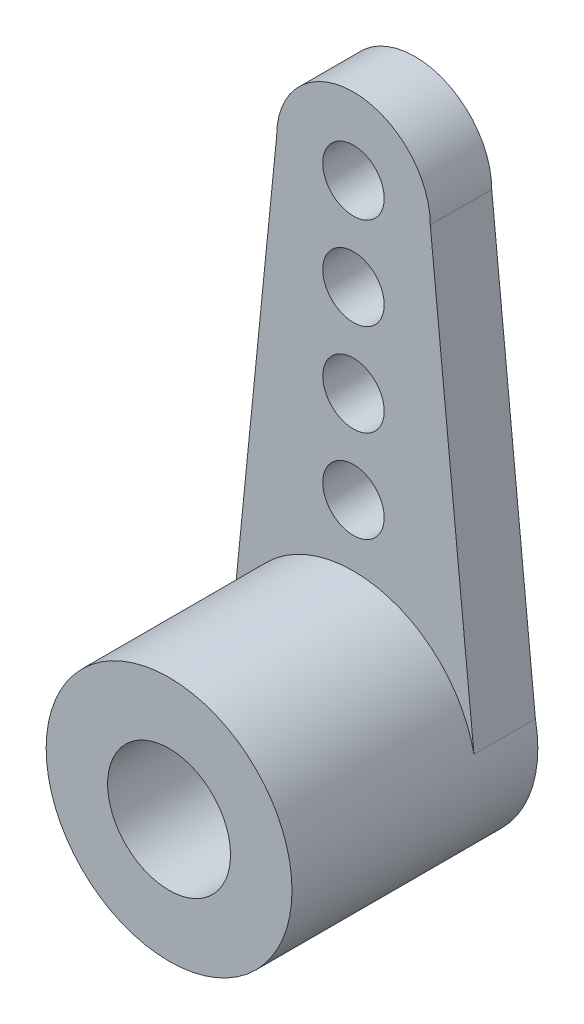
ISO-10303-21;
HEADER;
FILE_DESCRIPTION(('STEP AP214'),'2;1');
FILE_NAME('part.step','',(''),(''),'','','');
FILE_SCHEMA(('AUTOMOTIVE_DESIGN { 1 0 10303 214 1 1 1 1 }'));
ENDSEC;
DATA;
#1=APPLICATION_CONTEXT('core data for automotive mechanical design processes');
#2=APPLICATION_PROTOCOL_DEFINITION('international standard','automotive_design',2000,#1);
#3=PRODUCT_CONTEXT('',#1,'mechanical');
#4=PRODUCT('Part','Part','',(#3));
#5=PRODUCT_RELATED_PRODUCT_CATEGORY('part','',(#4));
#6=PRODUCT_DEFINITION_FORMATION('','',#4);
#7=PRODUCT_DEFINITION_CONTEXT('part definition',#1,'design');
#8=PRODUCT_DEFINITION('design','',#6,#7);
#9=PRODUCT_DEFINITION_SHAPE('','',#8);
#10=(LENGTH_UNIT() NAMED_UNIT(*) SI_UNIT(.MILLI.,.METRE.));
#11=(NAMED_UNIT(*) PLANE_ANGLE_UNIT() SI_UNIT($,.RADIAN.));
#12=(NAMED_UNIT(*) SI_UNIT($,.STERADIAN.) SOLID_ANGLE_UNIT());
#13=UNCERTAINTY_MEASURE_WITH_UNIT(LENGTH_MEASURE(1.E-05),#10,'distance_accuracy_value','');
#14=(GEOMETRIC_REPRESENTATION_CONTEXT(3) GLOBAL_UNCERTAINTY_ASSIGNED_CONTEXT((#13)) GLOBAL_UNIT_ASSIGNED_CONTEXT((#10,
#11,#12)) REPRESENTATION_CONTEXT('',''));
#15=CARTESIAN_POINT('',(0.,0.,0.));
#16=DIRECTION('',(0.,0.,1.));
#17=DIRECTION('',(1.,0.,0.));
#18=AXIS2_PLACEMENT_3D('',#15,#16,#17);
#19=CARTESIAN_POINT('',(0.,0.,8.));
#20=DIRECTION('',(0.,0.,-1.));
#21=DIRECTION('',(-1.,0.,0.));
#22=AXIS2_PLACEMENT_3D('',#19,#20,#21);
#23=CYLINDRICAL_SURFACE('',#22,4.);
#24=CARTESIAN_POINT('',(0.,0.,8.));
#25=DIRECTION('',(0.,0.,1.));
#26=DIRECTION('',(1.,0.,0.));
#27=AXIS2_PLACEMENT_3D('',#24,#25,#26);
#28=CIRCLE('',#27,4.);
#29=CARTESIAN_POINT('',(4.,0.,8.));
#30=VERTEX_POINT('',#29);
#31=EDGE_CURVE('E11',#30,#30,#28,.T.);
#32=ORIENTED_EDGE('',*,*,#31,.F.);
#33=EDGE_LOOP('',(#32));
#34=FACE_BOUND('',#33,.T.);
#35=DIRECTION('',(0.,0.,-1.));
#36=VECTOR('',#35,1.);
#37=CARTESIAN_POINT('',(-3.92079207920792,0.792079207920786,2.));
#38=LINE('',#37,#36);
#39=CARTESIAN_POINT('',(-3.92079207920792,0.792079207920786,2.));
#40=VERTEX_POINT('',#39);
#41=CARTESIAN_POINT('',(-3.92079207920792,0.792079207920786,0.));
#42=VERTEX_POINT('',#41);
#43=EDGE_CURVE('E92',#40,#42,#38,.T.);
#44=ORIENTED_EDGE('',*,*,#43,.T.);
#45=CARTESIAN_POINT('',(0.,0.,0.));
#46=DIRECTION('',(0.,0.,1.));
#47=DIRECTION('',(1.,0.,0.));
#48=AXIS2_PLACEMENT_3D('',#45,#46,#47);
#49=CIRCLE('',#48,4.);
#50=CARTESIAN_POINT('',(3.92079207920792,0.792079207920786,0.));
#51=VERTEX_POINT('',#50);
#52=EDGE_CURVE('E44',#42,#51,#49,.T.);
#53=ORIENTED_EDGE('',*,*,#52,.T.);
#54=DIRECTION('',(0.,0.,-1.));
#55=VECTOR('',#54,1.);
#56=CARTESIAN_POINT('',(3.92079207920792,0.792079207920786,2.));
#57=LINE('',#56,#55);
#58=CARTESIAN_POINT('',(3.92079207920792,0.792079207920786,2.));
#59=VERTEX_POINT('',#58);
#60=EDGE_CURVE('E52',#59,#51,#57,.T.);
#61=ORIENTED_EDGE('',*,*,#60,.F.);
#62=CARTESIAN_POINT('',(0.,0.,2.));
#63=DIRECTION('',(0.,0.,-1.));
#64=DIRECTION('',(-1.,0.,0.));
#65=AXIS2_PLACEMENT_3D('',#62,#63,#64);
#66=CIRCLE('',#65,4.);
#67=EDGE_CURVE('E56',#40,#59,#66,.T.);
#68=ORIENTED_EDGE('',*,*,#67,.F.);
#69=EDGE_LOOP('',(#44,#53,#61,#68));
#70=FACE_BOUND('',#69,.T.);
#71=ADVANCED_FACE('F36',(#34,#70),#23,.T.);
#72=CARTESIAN_POINT('',(0.,0.,8.));
#73=DIRECTION('',(0.,0.,1.));
#74=DIRECTION('',(1.,0.,0.));
#75=AXIS2_PLACEMENT_3D('',#72,#73,#74);
#76=PLANE('',#75);
#77=CARTESIAN_POINT('',(0.,0.,8.));
#78=DIRECTION('',(0.,0.,1.));
#79=DIRECTION('',(1.,0.,0.));
#80=AXIS2_PLACEMENT_3D('',#77,#78,#79);
#81=CIRCLE('',#80,2.);
#82=CARTESIAN_POINT('',(2.,0.,8.));
#83=VERTEX_POINT('',#82);
#84=EDGE_CURVE('E117',#83,#83,#81,.T.);
#85=ORIENTED_EDGE('',*,*,#84,.F.);
#86=EDGE_LOOP('',(#85));
#87=FACE_BOUND('',#86,.T.);
#88=ORIENTED_EDGE('',*,*,#31,.T.);
#89=EDGE_LOOP('',(#88));
#90=FACE_BOUND('',#89,.T.);
#91=ADVANCED_FACE('F126',(#87,#90),#76,.T.);
#92=CARTESIAN_POINT('',(0.,0.,0.));
#93=DIRECTION('',(0.,0.,1.));
#94=DIRECTION('',(1.,0.,0.));
#95=AXIS2_PLACEMENT_3D('',#92,#93,#94);
#96=PLANE('',#95);
#97=CARTESIAN_POINT('',(0.,0.,0.));
#98=DIRECTION('',(0.,0.,1.));
#99=DIRECTION('',(1.,0.,0.));
#100=AXIS2_PLACEMENT_3D('',#97,#98,#99);
#101=CIRCLE('',#100,1.5);
#102=CARTESIAN_POINT('',(1.5,0.,0.));
#103=VERTEX_POINT('',#102);
#104=EDGE_CURVE('E39',#103,#103,#101,.F.);
#105=ORIENTED_EDGE('',*,*,#104,.F.);
#106=EDGE_LOOP('',(#105));
#107=FACE_BOUND('',#106,.T.);
#108=CARTESIAN_POINT('',(0.,6.,0.));
#109=DIRECTION('',(0.,0.,-1.));
#110=DIRECTION('',(-1.,0.,0.));
#111=AXIS2_PLACEMENT_3D('',#108,#109,#110);
#112=CIRCLE('',#111,1.);
#113=CARTESIAN_POINT('',(-1.,6.,0.));
#114=VERTEX_POINT('',#113);
#115=EDGE_CURVE('E283',#114,#114,#112,.T.);
#116=ORIENTED_EDGE('',*,*,#115,.F.);
#117=EDGE_LOOP('',(#116));
#118=FACE_BOUND('',#117,.T.);
#119=CARTESIAN_POINT('',(0.,9.,0.));
#120=DIRECTION('',(0.,0.,-1.));
#121=DIRECTION('',(-1.,0.,0.));
#122=AXIS2_PLACEMENT_3D('',#119,#120,#121);
#123=CIRCLE('',#122,1.);
#124=CARTESIAN_POINT('',(-0.999999999999989,9.,0.));
#125=VERTEX_POINT('',#124);
#126=EDGE_CURVE('E286',#125,#125,#123,.T.);
#127=ORIENTED_EDGE('',*,*,#126,.F.);
#128=EDGE_LOOP('',(#127));
#129=FACE_BOUND('',#128,.T.);
#130=CARTESIAN_POINT('',(0.,12.,0.));
#131=DIRECTION('',(0.,0.,-1.));
#132=DIRECTION('',(-1.,0.,0.));
#133=AXIS2_PLACEMENT_3D('',#130,#131,#132);
#134=CIRCLE('',#133,1.);
#135=CARTESIAN_POINT('',(-0.999999999999979,12.,0.));
#136=VERTEX_POINT('',#135);
#137=EDGE_CURVE('E292',#136,#136,#134,.T.);
#138=ORIENTED_EDGE('',*,*,#137,.F.);
#139=EDGE_LOOP('',(#138));
#140=FACE_BOUND('',#139,.T.);
#141=CARTESIAN_POINT('',(0.,15.,0.));
#142=DIRECTION('',(0.,0.,-1.));
#143=DIRECTION('',(-1.,0.,0.));
#144=AXIS2_PLACEMENT_3D('',#141,#142,#143);
#145=CIRCLE('',#144,1.);
#146=CARTESIAN_POINT('',(-0.999999999999968,15.,0.));
#147=VERTEX_POINT('',#146);
#148=EDGE_CURVE('E279',#147,#147,#145,.T.);
#149=ORIENTED_EDGE('',*,*,#148,.F.);
#150=EDGE_LOOP('',(#149));
#151=FACE_BOUND('',#150,.T.);
#152=ORIENTED_EDGE('',*,*,#52,.F.);
#153=DIRECTION('',(-0.0995037190209989,-0.995037190209989,0.));
#154=VECTOR('',#153,1.);
#155=CARTESIAN_POINT('',(-3.96039603960396,0.396039603960396,0.));
#156=LINE('',#155,#154);
#157=CARTESIAN_POINT('',(-2.5,15.,0.));
#158=VERTEX_POINT('',#157);
#159=EDGE_CURVE('E105',#158,#42,#156,.T.);
#160=ORIENTED_EDGE('',*,*,#159,.F.);
#161=CARTESIAN_POINT('',(0.,15.,0.));
#162=DIRECTION('',(0.,0.,-1.));
#163=DIRECTION('',(-1.,0.,0.));
#164=AXIS2_PLACEMENT_3D('',#161,#162,#163);
#165=CIRCLE('',#164,2.5);
#166=CARTESIAN_POINT('',(2.5,15.,0.));
#167=VERTEX_POINT('',#166);
#168=EDGE_CURVE('E83',#158,#167,#165,.T.);
#169=ORIENTED_EDGE('',*,*,#168,.T.);
#170=DIRECTION('',(0.0995037190209989,-0.995037190209989,0.));
#171=VECTOR('',#170,1.);
#172=CARTESIAN_POINT('',(3.96039603960396,0.396039603960396,0.));
#173=LINE('',#172,#171);
#174=EDGE_CURVE('E94',#167,#51,#173,.T.);
#175=ORIENTED_EDGE('',*,*,#174,.T.);
#176=EDGE_LOOP('',(#152,#160,#169,#175));
#177=FACE_BOUND('',#176,.T.);
#178=ADVANCED_FACE('F123',(#107,#118,#129,#140,#151,#177),#96,.F.);
#179=CARTESIAN_POINT('',(0.,0.,8.));
#180=DIRECTION('',(0.,0.,-1.));
#181=DIRECTION('',(-1.,0.,0.));
#182=AXIS2_PLACEMENT_3D('',#179,#180,#181);
#183=CYLINDRICAL_SURFACE('',#182,2.);
#184=ORIENTED_EDGE('',*,*,#84,.T.);
#185=EDGE_LOOP('',(#184));
#186=FACE_BOUND('',#185,.T.);
#187=CARTESIAN_POINT('',(0.,0.,2.));
#188=DIRECTION('',(0.,0.,1.));
#189=DIRECTION('',(1.,0.,0.));
#190=AXIS2_PLACEMENT_3D('',#187,#188,#189);
#191=CIRCLE('',#190,2.);
#192=CARTESIAN_POINT('',(2.,0.,2.));
#193=VERTEX_POINT('',#192);
#194=EDGE_CURVE('E112',#193,#193,#191,.T.);
#195=ORIENTED_EDGE('',*,*,#194,.F.);
#196=EDGE_LOOP('',(#195));
#197=FACE_BOUND('',#196,.T.);
#198=ADVANCED_FACE('F125',(#186,#197),#183,.F.);
#199=CARTESIAN_POINT('',(0.,0.,2.));
#200=DIRECTION('',(0.,0.,1.));
#201=DIRECTION('',(1.,0.,0.));
#202=AXIS2_PLACEMENT_3D('',#199,#200,#201);
#203=PLANE('',#202);
#204=CARTESIAN_POINT('',(0.,0.,2.));
#205=DIRECTION('',(0.,0.,1.));
#206=DIRECTION('',(1.,0.,0.));
#207=AXIS2_PLACEMENT_3D('',#204,#205,#206);
#208=CIRCLE('',#207,1.5);
#209=CARTESIAN_POINT('',(1.5,0.,2.));
#210=VERTEX_POINT('',#209);
#211=EDGE_CURVE('E275',#210,#210,#208,.F.);
#212=ORIENTED_EDGE('',*,*,#211,.T.);
#213=EDGE_LOOP('',(#212));
#214=FACE_BOUND('',#213,.T.);
#215=ORIENTED_EDGE('',*,*,#194,.T.);
#216=EDGE_LOOP('',(#215));
#217=FACE_BOUND('',#216,.T.);
#218=ADVANCED_FACE('F132',(#214,#217),#203,.T.);
#219=CARTESIAN_POINT('',(-3.96039603960396,0.396039603960396,2.));
#220=DIRECTION('',(0.995037190209989,-0.0995037190209989,0.));
#221=DIRECTION('',(0.0995037190209989,0.995037190209989,0.));
#222=AXIS2_PLACEMENT_3D('',#219,#220,#221);
#223=PLANE('',#222);
#224=ORIENTED_EDGE('',*,*,#159,.T.);
#225=ORIENTED_EDGE('',*,*,#43,.F.);
#226=DIRECTION('',(-0.0995037190209989,-0.995037190209989,0.));
#227=VECTOR('',#226,1.);
#228=CARTESIAN_POINT('',(-3.96039603960396,0.396039603960396,2.));
#229=LINE('',#228,#227);
#230=CARTESIAN_POINT('',(-2.5,15.,2.));
#231=VERTEX_POINT('',#230);
#232=EDGE_CURVE('E90',#231,#40,#229,.T.);
#233=ORIENTED_EDGE('',*,*,#232,.F.);
#234=DIRECTION('',(0.,0.,-1.));
#235=VECTOR('',#234,1.);
#236=CARTESIAN_POINT('',(-2.5,15.,2.));
#237=LINE('',#236,#235);
#238=EDGE_CURVE('E77',#231,#158,#237,.T.);
#239=ORIENTED_EDGE('',*,*,#238,.T.);
#240=EDGE_LOOP('',(#224,#225,#233,#239));
#241=FACE_BOUND('',#240,.T.);
#242=ADVANCED_FACE('F91',(#241),#223,.F.);
#243=CARTESIAN_POINT('',(3.96039603960396,0.396039603960396,2.));
#244=DIRECTION('',(0.995037190209989,0.0995037190209989,0.));
#245=DIRECTION('',(-0.0995037190209989,0.995037190209989,0.));
#246=AXIS2_PLACEMENT_3D('',#243,#244,#245);
#247=PLANE('',#246);
#248=ORIENTED_EDGE('',*,*,#174,.F.);
#249=DIRECTION('',(0.,0.,-1.));
#250=VECTOR('',#249,1.);
#251=CARTESIAN_POINT('',(2.5,15.,2.));
#252=LINE('',#251,#250);
#253=CARTESIAN_POINT('',(2.5,15.,2.));
#254=VERTEX_POINT('',#253);
#255=EDGE_CURVE('E87',#254,#167,#252,.T.);
#256=ORIENTED_EDGE('',*,*,#255,.F.);
#257=DIRECTION('',(0.0995037190209989,-0.995037190209989,0.));
#258=VECTOR('',#257,1.);
#259=CARTESIAN_POINT('',(3.96039603960396,0.396039603960396,2.));
#260=LINE('',#259,#258);
#261=EDGE_CURVE('E99',#254,#59,#260,.T.);
#262=ORIENTED_EDGE('',*,*,#261,.T.);
#263=ORIENTED_EDGE('',*,*,#60,.T.);
#264=EDGE_LOOP('',(#248,#256,#262,#263));
#265=FACE_BOUND('',#264,.T.);
#266=ADVANCED_FACE('F122',(#265),#247,.T.);
#267=CARTESIAN_POINT('',(0.,15.,2.));
#268=DIRECTION('',(0.,0.,-1.));
#269=DIRECTION('',(-1.,0.,0.));
#270=AXIS2_PLACEMENT_3D('',#267,#268,#269);
#271=CYLINDRICAL_SURFACE('',#270,2.5);
#272=ORIENTED_EDGE('',*,*,#168,.F.);
#273=ORIENTED_EDGE('',*,*,#238,.F.);
#274=CARTESIAN_POINT('',(0.,15.,2.));
#275=DIRECTION('',(0.,0.,-1.));
#276=DIRECTION('',(-1.,0.,0.));
#277=AXIS2_PLACEMENT_3D('',#274,#275,#276);
#278=CIRCLE('',#277,2.5);
#279=EDGE_CURVE('E81',#231,#254,#278,.T.);
#280=ORIENTED_EDGE('',*,*,#279,.T.);
#281=ORIENTED_EDGE('',*,*,#255,.T.);
#282=EDGE_LOOP('',(#272,#273,#280,#281));
#283=FACE_BOUND('',#282,.T.);
#284=ADVANCED_FACE('F79',(#283),#271,.T.);
#285=CARTESIAN_POINT('',(0.,0.,2.));
#286=DIRECTION('',(0.,0.,-1.));
#287=DIRECTION('',(-1.,0.,0.));
#288=AXIS2_PLACEMENT_3D('',#285,#286,#287);
#289=PLANE('',#288);
#290=CARTESIAN_POINT('',(0.,6.,2.));
#291=DIRECTION('',(0.,0.,-1.));
#292=DIRECTION('',(-1.,0.,0.));
#293=AXIS2_PLACEMENT_3D('',#290,#291,#292);
#294=CIRCLE('',#293,1.);
#295=CARTESIAN_POINT('',(-1.,6.,2.));
#296=VERTEX_POINT('',#295);
#297=EDGE_CURVE('E107',#296,#296,#294,.F.);
#298=ORIENTED_EDGE('',*,*,#297,.F.);
#299=EDGE_LOOP('',(#298));
#300=FACE_BOUND('',#299,.T.);
#301=CARTESIAN_POINT('',(0.,9.,2.));
#302=DIRECTION('',(0.,0.,-1.));
#303=DIRECTION('',(-1.,0.,0.));
#304=AXIS2_PLACEMENT_3D('',#301,#302,#303);
#305=CIRCLE('',#304,1.);
#306=CARTESIAN_POINT('',(-0.999999999999989,9.,2.));
#307=VERTEX_POINT('',#306);
#308=EDGE_CURVE('E289',#307,#307,#305,.F.);
#309=ORIENTED_EDGE('',*,*,#308,.F.);
#310=EDGE_LOOP('',(#309));
#311=FACE_BOUND('',#310,.T.);
#312=CARTESIAN_POINT('',(0.,12.,2.));
#313=DIRECTION('',(0.,0.,-1.));
#314=DIRECTION('',(-1.,0.,0.));
#315=AXIS2_PLACEMENT_3D('',#312,#313,#314);
#316=CIRCLE('',#315,1.);
#317=CARTESIAN_POINT('',(-0.999999999999979,12.,2.));
#318=VERTEX_POINT('',#317);
#319=EDGE_CURVE('E295',#318,#318,#316,.F.);
#320=ORIENTED_EDGE('',*,*,#319,.F.);
#321=EDGE_LOOP('',(#320));
#322=FACE_BOUND('',#321,.T.);
#323=CARTESIAN_POINT('',(0.,15.,2.));
#324=DIRECTION('',(0.,0.,-1.));
#325=DIRECTION('',(-1.,0.,0.));
#326=AXIS2_PLACEMENT_3D('',#323,#324,#325);
#327=CIRCLE('',#326,1.);
#328=CARTESIAN_POINT('',(-0.999999999999968,15.,2.));
#329=VERTEX_POINT('',#328);
#330=EDGE_CURVE('E277',#329,#329,#327,.F.);
#331=ORIENTED_EDGE('',*,*,#330,.F.);
#332=EDGE_LOOP('',(#331));
#333=FACE_BOUND('',#332,.T.);
#334=ORIENTED_EDGE('',*,*,#232,.T.);
#335=ORIENTED_EDGE('',*,*,#67,.T.);
#336=ORIENTED_EDGE('',*,*,#261,.F.);
#337=ORIENTED_EDGE('',*,*,#279,.F.);
#338=EDGE_LOOP('',(#334,#335,#336,#337));
#339=FACE_BOUND('',#338,.T.);
#340=ADVANCED_FACE('F97',(#300,#311,#322,#333,#339),#289,.F.);
#341=CARTESIAN_POINT('',(0.,15.,8.001));
#342=DIRECTION('',(0.,0.,-1.));
#343=DIRECTION('',(-1.,0.,0.));
#344=AXIS2_PLACEMENT_3D('',#341,#342,#343);
#345=CYLINDRICAL_SURFACE('',#344,1.);
#346=ORIENTED_EDGE('',*,*,#148,.T.);
#347=EDGE_LOOP('',(#346));
#348=FACE_BOUND('',#347,.T.);
#349=ORIENTED_EDGE('',*,*,#330,.T.);
#350=EDGE_LOOP('',(#349));
#351=FACE_BOUND('',#350,.T.);
#352=ADVANCED_FACE('F190',(#348,#351),#345,.F.);
#353=CARTESIAN_POINT('',(0.,12.,8.001));
#354=DIRECTION('',(0.,0.,-1.));
#355=DIRECTION('',(-1.,0.,0.));
#356=AXIS2_PLACEMENT_3D('',#353,#354,#355);
#357=CYLINDRICAL_SURFACE('',#356,1.);
#358=ORIENTED_EDGE('',*,*,#137,.T.);
#359=EDGE_LOOP('',(#358));
#360=FACE_BOUND('',#359,.T.);
#361=ORIENTED_EDGE('',*,*,#319,.T.);
#362=EDGE_LOOP('',(#361));
#363=FACE_BOUND('',#362,.T.);
#364=ADVANCED_FACE('F198',(#360,#363),#357,.F.);
#365=CARTESIAN_POINT('',(0.,9.,8.001));
#366=DIRECTION('',(0.,0.,-1.));
#367=DIRECTION('',(-1.,0.,0.));
#368=AXIS2_PLACEMENT_3D('',#365,#366,#367);
#369=CYLINDRICAL_SURFACE('',#368,1.);
#370=ORIENTED_EDGE('',*,*,#126,.T.);
#371=EDGE_LOOP('',(#370));
#372=FACE_BOUND('',#371,.T.);
#373=ORIENTED_EDGE('',*,*,#308,.T.);
#374=EDGE_LOOP('',(#373));
#375=FACE_BOUND('',#374,.T.);
#376=ADVANCED_FACE('F206',(#372,#375),#369,.F.);
#377=CARTESIAN_POINT('',(0.,6.,8.001));
#378=DIRECTION('',(0.,0.,-1.));
#379=DIRECTION('',(-1.,0.,0.));
#380=AXIS2_PLACEMENT_3D('',#377,#378,#379);
#381=CYLINDRICAL_SURFACE('',#380,1.);
#382=ORIENTED_EDGE('',*,*,#115,.T.);
#383=EDGE_LOOP('',(#382));
#384=FACE_BOUND('',#383,.T.);
#385=ORIENTED_EDGE('',*,*,#297,.T.);
#386=EDGE_LOOP('',(#385));
#387=FACE_BOUND('',#386,.T.);
#388=ADVANCED_FACE('F214',(#384,#387),#381,.F.);
#389=CARTESIAN_POINT('',(0.,0.,-10.));
#390=DIRECTION('',(0.,0.,1.));
#391=DIRECTION('',(1.,0.,0.));
#392=AXIS2_PLACEMENT_3D('',#389,#390,#391);
#393=CYLINDRICAL_SURFACE('',#392,1.5);
#394=ORIENTED_EDGE('',*,*,#211,.F.);
#395=EDGE_LOOP('',(#394));
#396=FACE_BOUND('',#395,.T.);
#397=ORIENTED_EDGE('',*,*,#104,.T.);
#398=EDGE_LOOP('',(#397));
#399=FACE_BOUND('',#398,.T.);
#400=ADVANCED_FACE('F222',(#396,#399),#393,.F.);
#401=CLOSED_SHELL('',(#71,#91,#178,#198,#218,#242,#266,#284,#340,#352,#364,#376,#388,#400));
#402=MANIFOLD_SOLID_BREP('B2',#401);
#403=ADVANCED_BREP_SHAPE_REPRESENTATION('',(#18,#402),#14);
#404=SHAPE_DEFINITION_REPRESENTATION(#9,#403);
ENDSEC;
END-ISO-10303-21;
